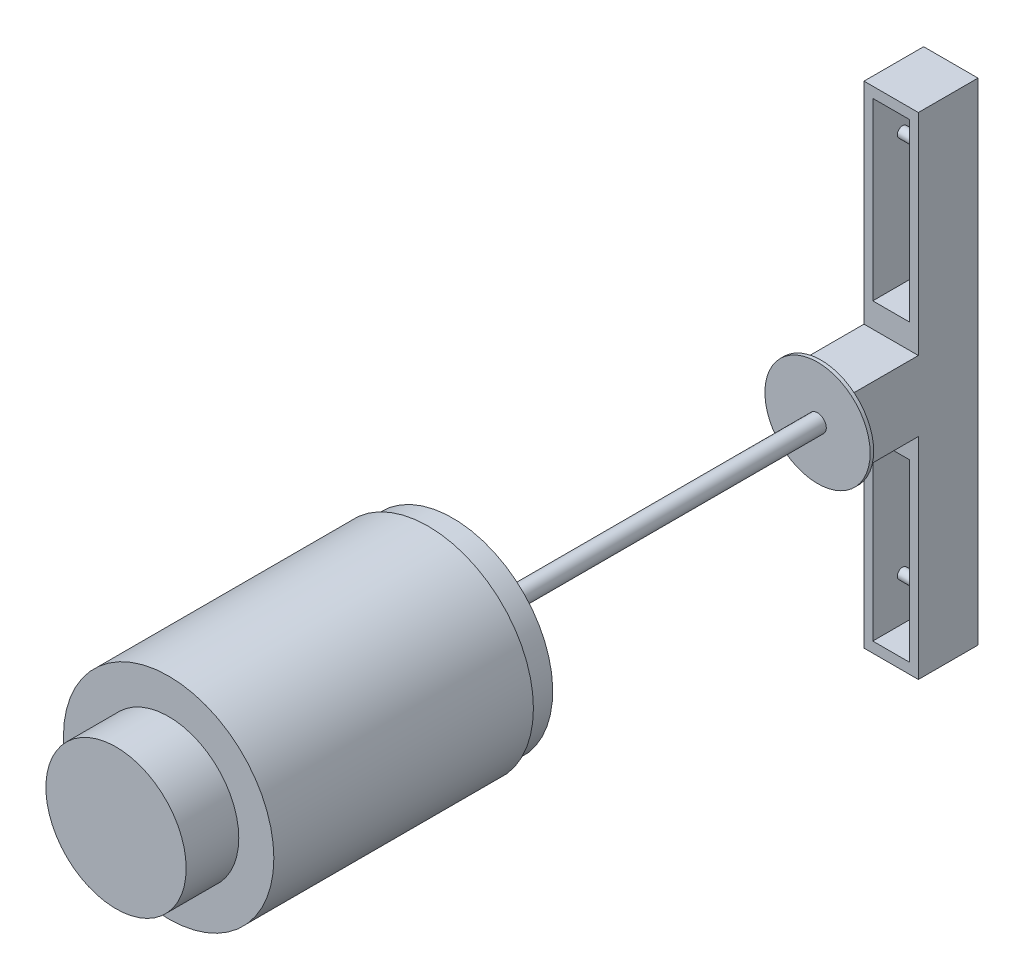
ISO-10303-21;
HEADER;
FILE_DESCRIPTION(('STEP AP214'),'2;1');
FILE_NAME('part.step','',(''),(''),'','','');
FILE_SCHEMA(('AUTOMOTIVE_DESIGN { 1 0 10303 214 1 1 1 1 }'));
ENDSEC;
DATA;
#1=APPLICATION_CONTEXT('core data for automotive mechanical design processes');
#2=APPLICATION_PROTOCOL_DEFINITION('international standard','automotive_design',2000,#1);
#3=PRODUCT_CONTEXT('',#1,'mechanical');
#4=PRODUCT('Part','Part','',(#3));
#5=PRODUCT_RELATED_PRODUCT_CATEGORY('part','',(#4));
#6=PRODUCT_DEFINITION_FORMATION('','',#4);
#7=PRODUCT_DEFINITION_CONTEXT('part definition',#1,'design');
#8=PRODUCT_DEFINITION('design','',#6,#7);
#9=PRODUCT_DEFINITION_SHAPE('','',#8);
#10=(LENGTH_UNIT() NAMED_UNIT(*) SI_UNIT(.MILLI.,.METRE.));
#11=(NAMED_UNIT(*) PLANE_ANGLE_UNIT() SI_UNIT($,.RADIAN.));
#12=(NAMED_UNIT(*) SI_UNIT($,.STERADIAN.) SOLID_ANGLE_UNIT());
#13=UNCERTAINTY_MEASURE_WITH_UNIT(LENGTH_MEASURE(1.E-05),#10,'distance_accuracy_value','');
#14=(GEOMETRIC_REPRESENTATION_CONTEXT(3) GLOBAL_UNCERTAINTY_ASSIGNED_CONTEXT((#13)) GLOBAL_UNIT_ASSIGNED_CONTEXT((#10,
#11,#12)) REPRESENTATION_CONTEXT('',''));
#15=CARTESIAN_POINT('',(0.,0.,0.));
#16=DIRECTION('',(0.,0.,1.));
#17=DIRECTION('',(1.,0.,0.));
#18=AXIS2_PLACEMENT_3D('',#15,#16,#17);
#19=CARTESIAN_POINT('',(-5.25,54.5,-28.5));
#20=DIRECTION('',(1.,0.,0.));
#21=DIRECTION('',(0.,0.,-1.));
#22=AXIS2_PLACEMENT_3D('',#19,#20,#21);
#23=CYLINDRICAL_SURFACE('',#22,1.5);
#24=CARTESIAN_POINT('',(5.25,54.5,-28.5));
#25=DIRECTION('',(1.,0.,0.));
#26=DIRECTION('',(0.,0.,-1.));
#27=AXIS2_PLACEMENT_3D('',#24,#25,#26);
#28=CIRCLE('',#27,1.5);
#29=CARTESIAN_POINT('',(5.25,54.5,-30.));
#30=VERTEX_POINT('',#29);
#31=EDGE_CURVE('E20',#30,#30,#28,.F.);
#32=ORIENTED_EDGE('',*,*,#31,.T.);
#33=EDGE_LOOP('',(#32));
#34=FACE_BOUND('',#33,.T.);
#35=CARTESIAN_POINT('',(-5.25,54.5,-28.5));
#36=DIRECTION('',(1.,0.,0.));
#37=DIRECTION('',(0.,0.,-1.));
#38=AXIS2_PLACEMENT_3D('',#35,#36,#37);
#39=CIRCLE('',#38,1.5);
#40=CARTESIAN_POINT('',(-5.25,54.5,-30.));
#41=VERTEX_POINT('',#40);
#42=EDGE_CURVE('E171',#41,#41,#39,.T.);
#43=ORIENTED_EDGE('',*,*,#42,.T.);
#44=EDGE_LOOP('',(#43));
#45=FACE_BOUND('',#44,.T.);
#46=ADVANCED_FACE('F17',(#34,#45),#23,.T.);
#47=CARTESIAN_POINT('',(-5.25,-54.5,-28.5));
#48=DIRECTION('',(1.,0.,0.));
#49=DIRECTION('',(0.,0.,-1.));
#50=AXIS2_PLACEMENT_3D('',#47,#48,#49);
#51=CYLINDRICAL_SURFACE('',#50,1.5);
#52=CARTESIAN_POINT('',(5.25,-54.5,-28.5));
#53=DIRECTION('',(1.,0.,0.));
#54=DIRECTION('',(0.,0.,-1.));
#55=AXIS2_PLACEMENT_3D('',#52,#53,#54);
#56=CIRCLE('',#55,1.5);
#57=CARTESIAN_POINT('',(5.25,-54.5,-30.));
#58=VERTEX_POINT('',#57);
#59=EDGE_CURVE('E163',#58,#58,#56,.F.);
#60=ORIENTED_EDGE('',*,*,#59,.T.);
#61=EDGE_LOOP('',(#60));
#62=FACE_BOUND('',#61,.T.);
#63=CARTESIAN_POINT('',(-5.25,-54.5,-28.5));
#64=DIRECTION('',(1.,0.,0.));
#65=DIRECTION('',(0.,0.,-1.));
#66=AXIS2_PLACEMENT_3D('',#63,#64,#65);
#67=CIRCLE('',#66,1.5);
#68=CARTESIAN_POINT('',(-5.25,-54.5,-30.));
#69=VERTEX_POINT('',#68);
#70=EDGE_CURVE('E141',#69,#69,#67,.T.);
#71=ORIENTED_EDGE('',*,*,#70,.T.);
#72=EDGE_LOOP('',(#71));
#73=FACE_BOUND('',#72,.T.);
#74=ADVANCED_FACE('F282',(#62,#73),#51,.T.);
#75=CARTESIAN_POINT('',(5.25,0.,0.));
#76=DIRECTION('',(1.,0.,0.));
#77=DIRECTION('',(0.,0.,-1.));
#78=AXIS2_PLACEMENT_3D('',#75,#76,#77);
#79=PLANE('',#78);
#80=ORIENTED_EDGE('',*,*,#31,.F.);
#81=EDGE_LOOP('',(#80));
#82=FACE_BOUND('',#81,.T.);
#83=DIRECTION('',(0.,0.,-1.));
#84=VECTOR('',#83,1.);
#85=CARTESIAN_POINT('',(5.25,17.,0.));
#86=LINE('',#85,#84);
#87=CARTESIAN_POINT('',(5.25,17.,-37.));
#88=VERTEX_POINT('',#87);
#89=CARTESIAN_POINT('',(5.25,17.,-20.));
#90=VERTEX_POINT('',#89);
#91=EDGE_CURVE('E168',#88,#90,#86,.F.);
#92=ORIENTED_EDGE('',*,*,#91,.T.);
#93=DIRECTION('',(0.,1.,0.));
#94=VECTOR('',#93,1.);
#95=CARTESIAN_POINT('',(5.25,0.,-20.));
#96=LINE('',#95,#94);
#97=CARTESIAN_POINT('',(5.25,67.,-20.));
#98=VERTEX_POINT('',#97);
#99=EDGE_CURVE('E236',#90,#98,#96,.T.);
#100=ORIENTED_EDGE('',*,*,#99,.T.);
#101=DIRECTION('',(0.,0.,1.));
#102=VECTOR('',#101,1.);
#103=CARTESIAN_POINT('',(5.25,67.,0.));
#104=LINE('',#103,#102);
#105=CARTESIAN_POINT('',(5.25,67.,-37.));
#106=VERTEX_POINT('',#105);
#107=EDGE_CURVE('E174',#98,#106,#104,.F.);
#108=ORIENTED_EDGE('',*,*,#107,.T.);
#109=DIRECTION('',(0.,1.,0.));
#110=VECTOR('',#109,1.);
#111=CARTESIAN_POINT('',(5.25,0.,-37.));
#112=LINE('',#111,#110);
#113=EDGE_CURVE('E246',#106,#88,#112,.F.);
#114=ORIENTED_EDGE('',*,*,#113,.T.);
#115=EDGE_LOOP('',(#92,#100,#108,#114));
#116=FACE_BOUND('',#115,.T.);
#117=ADVANCED_FACE('F280',(#82,#116),#79,.F.);
#118=CARTESIAN_POINT('',(0.,67.,0.));
#119=DIRECTION('',(0.,1.,0.));
#120=DIRECTION('',(0.,0.,1.));
#121=AXIS2_PLACEMENT_3D('',#118,#119,#120);
#122=PLANE('',#121);
#123=ORIENTED_EDGE('',*,*,#107,.F.);
#124=DIRECTION('',(-1.,0.,0.));
#125=VECTOR('',#124,1.);
#126=CARTESIAN_POINT('',(0.,67.,-20.));
#127=LINE('',#126,#125);
#128=CARTESIAN_POINT('',(-5.25,67.,-20.));
#129=VERTEX_POINT('',#128);
#130=EDGE_CURVE('E231',#98,#129,#127,.T.);
#131=ORIENTED_EDGE('',*,*,#130,.T.);
#132=DIRECTION('',(0.,0.,1.));
#133=VECTOR('',#132,1.);
#134=CARTESIAN_POINT('',(-5.25,67.,0.));
#135=LINE('',#134,#133);
#136=CARTESIAN_POINT('',(-5.25,67.,-37.));
#137=VERTEX_POINT('',#136);
#138=EDGE_CURVE('E172',#129,#137,#135,.F.);
#139=ORIENTED_EDGE('',*,*,#138,.T.);
#140=DIRECTION('',(1.,0.,0.));
#141=VECTOR('',#140,1.);
#142=CARTESIAN_POINT('',(0.,67.,-37.));
#143=LINE('',#142,#141);
#144=EDGE_CURVE('E249',#137,#106,#143,.T.);
#145=ORIENTED_EDGE('',*,*,#144,.T.);
#146=EDGE_LOOP('',(#123,#131,#139,#145));
#147=FACE_BOUND('',#146,.T.);
#148=ADVANCED_FACE('F214',(#147),#122,.F.);
#149=CARTESIAN_POINT('',(-5.25,0.,0.));
#150=DIRECTION('',(-1.,0.,0.));
#151=DIRECTION('',(0.,0.,1.));
#152=AXIS2_PLACEMENT_3D('',#149,#150,#151);
#153=PLANE('',#152);
#154=ORIENTED_EDGE('',*,*,#42,.F.);
#155=EDGE_LOOP('',(#154));
#156=FACE_BOUND('',#155,.T.);
#157=ORIENTED_EDGE('',*,*,#138,.F.);
#158=DIRECTION('',(0.,1.,0.));
#159=VECTOR('',#158,1.);
#160=CARTESIAN_POINT('',(-5.25,0.,-20.));
#161=LINE('',#160,#159);
#162=CARTESIAN_POINT('',(-5.25,17.,-20.));
#163=VERTEX_POINT('',#162);
#164=EDGE_CURVE('E219',#129,#163,#161,.F.);
#165=ORIENTED_EDGE('',*,*,#164,.T.);
#166=DIRECTION('',(0.,0.,-1.));
#167=VECTOR('',#166,1.);
#168=CARTESIAN_POINT('',(-5.25,17.,0.));
#169=LINE('',#168,#167);
#170=CARTESIAN_POINT('',(-5.25,17.,-37.));
#171=VERTEX_POINT('',#170);
#172=EDGE_CURVE('E166',#163,#171,#169,.T.);
#173=ORIENTED_EDGE('',*,*,#172,.T.);
#174=DIRECTION('',(0.,1.,0.));
#175=VECTOR('',#174,1.);
#176=CARTESIAN_POINT('',(-5.25,0.,-37.));
#177=LINE('',#176,#175);
#178=EDGE_CURVE('E221',#171,#137,#177,.T.);
#179=ORIENTED_EDGE('',*,*,#178,.T.);
#180=EDGE_LOOP('',(#157,#165,#173,#179));
#181=FACE_BOUND('',#180,.T.);
#182=ADVANCED_FACE('F210',(#156,#181),#153,.F.);
#183=CARTESIAN_POINT('',(0.,17.,0.));
#184=DIRECTION('',(0.,-1.,0.));
#185=DIRECTION('',(0.,0.,-1.));
#186=AXIS2_PLACEMENT_3D('',#183,#184,#185);
#187=PLANE('',#186);
#188=ORIENTED_EDGE('',*,*,#172,.F.);
#189=DIRECTION('',(-1.,0.,0.));
#190=VECTOR('',#189,1.);
#191=CARTESIAN_POINT('',(0.,17.,-20.));
#192=LINE('',#191,#190);
#193=EDGE_CURVE('E234',#163,#90,#192,.F.);
#194=ORIENTED_EDGE('',*,*,#193,.T.);
#195=ORIENTED_EDGE('',*,*,#91,.F.);
#196=DIRECTION('',(1.,0.,0.));
#197=VECTOR('',#196,1.);
#198=CARTESIAN_POINT('',(0.,17.,-37.));
#199=LINE('',#198,#197);
#200=EDGE_CURVE('E252',#88,#171,#199,.F.);
#201=ORIENTED_EDGE('',*,*,#200,.T.);
#202=EDGE_LOOP('',(#188,#194,#195,#201));
#203=FACE_BOUND('',#202,.T.);
#204=ADVANCED_FACE('F213',(#203),#187,.F.);
#205=CARTESIAN_POINT('',(0.,-67.,0.));
#206=DIRECTION('',(0.,1.,0.));
#207=DIRECTION('',(0.,0.,1.));
#208=AXIS2_PLACEMENT_3D('',#205,#206,#207);
#209=PLANE('',#208);
#210=DIRECTION('',(-1.,0.,0.));
#211=VECTOR('',#210,1.);
#212=CARTESIAN_POINT('',(0.,-67.,-20.));
#213=LINE('',#212,#211);
#214=CARTESIAN_POINT('',(-5.25,-67.,-20.));
#215=VERTEX_POINT('',#214);
#216=CARTESIAN_POINT('',(5.25,-67.,-20.));
#217=VERTEX_POINT('',#216);
#218=EDGE_CURVE('E269',#215,#217,#213,.F.);
#219=ORIENTED_EDGE('',*,*,#218,.T.);
#220=DIRECTION('',(0.,0.,-1.));
#221=VECTOR('',#220,1.);
#222=CARTESIAN_POINT('',(5.25,-67.,0.));
#223=LINE('',#222,#221);
#224=CARTESIAN_POINT('',(5.25,-67.,-37.));
#225=VERTEX_POINT('',#224);
#226=EDGE_CURVE('E164',#217,#225,#223,.T.);
#227=ORIENTED_EDGE('',*,*,#226,.T.);
#228=DIRECTION('',(1.,0.,0.));
#229=VECTOR('',#228,1.);
#230=CARTESIAN_POINT('',(0.,-67.,-37.));
#231=LINE('',#230,#229);
#232=CARTESIAN_POINT('',(-5.25,-67.,-37.));
#233=VERTEX_POINT('',#232);
#234=EDGE_CURVE('E255',#225,#233,#231,.F.);
#235=ORIENTED_EDGE('',*,*,#234,.T.);
#236=DIRECTION('',(0.,0.,1.));
#237=VECTOR('',#236,1.);
#238=CARTESIAN_POINT('',(-5.25,-67.,0.));
#239=LINE('',#238,#237);
#240=EDGE_CURVE('E128',#233,#215,#239,.T.);
#241=ORIENTED_EDGE('',*,*,#240,.T.);
#242=EDGE_LOOP('',(#219,#227,#235,#241));
#243=FACE_BOUND('',#242,.T.);
#244=ADVANCED_FACE('F378',(#243),#209,.T.);
#245=CARTESIAN_POINT('',(5.25,0.,0.));
#246=DIRECTION('',(1.,0.,0.));
#247=DIRECTION('',(0.,0.,-1.));
#248=AXIS2_PLACEMENT_3D('',#245,#246,#247);
#249=PLANE('',#248);
#250=ORIENTED_EDGE('',*,*,#59,.F.);
#251=EDGE_LOOP('',(#250));
#252=FACE_BOUND('',#251,.T.);
#253=ORIENTED_EDGE('',*,*,#226,.F.);
#254=DIRECTION('',(0.,1.,0.));
#255=VECTOR('',#254,1.);
#256=CARTESIAN_POINT('',(5.25,0.,-20.));
#257=LINE('',#256,#255);
#258=CARTESIAN_POINT('',(5.25,-17.,-20.));
#259=VERTEX_POINT('',#258);
#260=EDGE_CURVE('E260',#217,#259,#257,.T.);
#261=ORIENTED_EDGE('',*,*,#260,.T.);
#262=DIRECTION('',(0.,0.,-1.));
#263=VECTOR('',#262,1.);
#264=CARTESIAN_POINT('',(5.25,-17.,0.));
#265=LINE('',#264,#263);
#266=CARTESIAN_POINT('',(5.25,-17.,-37.));
#267=VERTEX_POINT('',#266);
#268=EDGE_CURVE('E161',#259,#267,#265,.T.);
#269=ORIENTED_EDGE('',*,*,#268,.T.);
#270=DIRECTION('',(0.,1.,0.));
#271=VECTOR('',#270,1.);
#272=CARTESIAN_POINT('',(5.25,0.,-37.));
#273=LINE('',#272,#271);
#274=EDGE_CURVE('E151',#267,#225,#273,.F.);
#275=ORIENTED_EDGE('',*,*,#274,.T.);
#276=EDGE_LOOP('',(#253,#261,#269,#275));
#277=FACE_BOUND('',#276,.T.);
#278=ADVANCED_FACE('F257',(#252,#277),#249,.F.);
#279=CARTESIAN_POINT('',(0.,-17.,0.));
#280=DIRECTION('',(0.,-1.,0.));
#281=DIRECTION('',(0.,0.,-1.));
#282=AXIS2_PLACEMENT_3D('',#279,#280,#281);
#283=PLANE('',#282);
#284=DIRECTION('',(-1.,0.,0.));
#285=VECTOR('',#284,1.);
#286=CARTESIAN_POINT('',(0.,-17.,-20.));
#287=LINE('',#286,#285);
#288=CARTESIAN_POINT('',(-5.25,-17.,-20.));
#289=VERTEX_POINT('',#288);
#290=EDGE_CURVE('E139',#259,#289,#287,.T.);
#291=ORIENTED_EDGE('',*,*,#290,.T.);
#292=DIRECTION('',(0.,0.,1.));
#293=VECTOR('',#292,1.);
#294=CARTESIAN_POINT('',(-5.25,-17.,0.));
#295=LINE('',#294,#293);
#296=CARTESIAN_POINT('',(-5.25,-17.,-37.));
#297=VERTEX_POINT('',#296);
#298=EDGE_CURVE('E134',#289,#297,#295,.F.);
#299=ORIENTED_EDGE('',*,*,#298,.T.);
#300=DIRECTION('',(1.,0.,0.));
#301=VECTOR('',#300,1.);
#302=CARTESIAN_POINT('',(0.,-17.,-37.));
#303=LINE('',#302,#301);
#304=EDGE_CURVE('E137',#297,#267,#303,.T.);
#305=ORIENTED_EDGE('',*,*,#304,.T.);
#306=ORIENTED_EDGE('',*,*,#268,.F.);
#307=EDGE_LOOP('',(#291,#299,#305,#306));
#308=FACE_BOUND('',#307,.T.);
#309=ADVANCED_FACE('F136',(#308),#283,.T.);
#310=CARTESIAN_POINT('',(-5.25,0.,0.));
#311=DIRECTION('',(-1.,0.,0.));
#312=DIRECTION('',(0.,0.,1.));
#313=AXIS2_PLACEMENT_3D('',#310,#311,#312);
#314=PLANE('',#313);
#315=ORIENTED_EDGE('',*,*,#70,.F.);
#316=EDGE_LOOP('',(#315));
#317=FACE_BOUND('',#316,.T.);
#318=ORIENTED_EDGE('',*,*,#298,.F.);
#319=DIRECTION('',(0.,1.,0.));
#320=VECTOR('',#319,1.);
#321=CARTESIAN_POINT('',(-5.25,0.,-20.));
#322=LINE('',#321,#320);
#323=EDGE_CURVE('E265',#289,#215,#322,.F.);
#324=ORIENTED_EDGE('',*,*,#323,.T.);
#325=ORIENTED_EDGE('',*,*,#240,.F.);
#326=DIRECTION('',(0.,1.,0.));
#327=VECTOR('',#326,1.);
#328=CARTESIAN_POINT('',(-5.25,0.,-37.));
#329=LINE('',#328,#327);
#330=EDGE_CURVE('E148',#233,#297,#329,.T.);
#331=ORIENTED_EDGE('',*,*,#330,.T.);
#332=EDGE_LOOP('',(#318,#324,#325,#331));
#333=FACE_BOUND('',#332,.T.);
#334=ADVANCED_FACE('F153',(#317,#333),#314,.F.);
#335=CARTESIAN_POINT('',(0.,70.,0.));
#336=DIRECTION('',(0.,1.,0.));
#337=DIRECTION('',(0.,0.,1.));
#338=AXIS2_PLACEMENT_3D('',#335,#336,#337);
#339=PLANE('',#338);
#340=DIRECTION('',(1.,0.,0.));
#341=VECTOR('',#340,1.);
#342=CARTESIAN_POINT('',(0.,70.,-37.));
#343=LINE('',#342,#341);
#344=CARTESIAN_POINT('',(7.75,70.,-37.));
#345=VERTEX_POINT('',#344);
#346=CARTESIAN_POINT('',(-7.75,70.,-37.));
#347=VERTEX_POINT('',#346);
#348=EDGE_CURVE('E154',#345,#347,#343,.F.);
#349=ORIENTED_EDGE('',*,*,#348,.T.);
#350=DIRECTION('',(0.,0.,1.));
#351=VECTOR('',#350,1.);
#352=CARTESIAN_POINT('',(-7.75,70.,0.));
#353=LINE('',#352,#351);
#354=CARTESIAN_POINT('',(-7.75,70.,-20.));
#355=VERTEX_POINT('',#354);
#356=EDGE_CURVE('E267',#347,#355,#353,.T.);
#357=ORIENTED_EDGE('',*,*,#356,.T.);
#358=DIRECTION('',(-1.,0.,0.));
#359=VECTOR('',#358,1.);
#360=CARTESIAN_POINT('',(0.,70.,-20.));
#361=LINE('',#360,#359);
#362=CARTESIAN_POINT('',(7.75,70.,-20.));
#363=VERTEX_POINT('',#362);
#364=EDGE_CURVE('E238',#355,#363,#361,.F.);
#365=ORIENTED_EDGE('',*,*,#364,.T.);
#366=DIRECTION('',(0.,0.,-1.));
#367=VECTOR('',#366,1.);
#368=CARTESIAN_POINT('',(7.75,70.,0.));
#369=LINE('',#368,#367);
#370=EDGE_CURVE('E576',#363,#345,#369,.T.);
#371=ORIENTED_EDGE('',*,*,#370,.T.);
#372=EDGE_LOOP('',(#349,#357,#365,#371));
#373=FACE_BOUND('',#372,.T.);
#374=ADVANCED_FACE('F367',(#373),#339,.T.);
#375=CARTESIAN_POINT('',(0.,0.,-37.));
#376=DIRECTION('',(0.,0.,1.));
#377=DIRECTION('',(1.,0.,0.));
#378=AXIS2_PLACEMENT_3D('',#375,#376,#377);
#379=PLANE('',#378);
#380=ORIENTED_EDGE('',*,*,#144,.F.);
#381=ORIENTED_EDGE('',*,*,#178,.F.);
#382=ORIENTED_EDGE('',*,*,#200,.F.);
#383=ORIENTED_EDGE('',*,*,#113,.F.);
#384=EDGE_LOOP('',(#380,#381,#382,#383));
#385=FACE_BOUND('',#384,.T.);
#386=ORIENTED_EDGE('',*,*,#274,.F.);
#387=ORIENTED_EDGE('',*,*,#304,.F.);
#388=ORIENTED_EDGE('',*,*,#330,.F.);
#389=ORIENTED_EDGE('',*,*,#234,.F.);
#390=EDGE_LOOP('',(#386,#387,#388,#389));
#391=FACE_BOUND('',#390,.T.);
#392=DIRECTION('',(1.,0.,0.));
#393=VECTOR('',#392,1.);
#394=CARTESIAN_POINT('',(0.,-70.,-37.));
#395=LINE('',#394,#393);
#396=CARTESIAN_POINT('',(7.75,-70.,-37.));
#397=VERTEX_POINT('',#396);
#398=CARTESIAN_POINT('',(-7.75,-70.,-37.));
#399=VERTEX_POINT('',#398);
#400=EDGE_CURVE('E244',#397,#399,#395,.F.);
#401=ORIENTED_EDGE('',*,*,#400,.T.);
#402=DIRECTION('',(0.,1.,0.));
#403=VECTOR('',#402,1.);
#404=CARTESIAN_POINT('',(-7.75,0.,-37.));
#405=LINE('',#404,#403);
#406=EDGE_CURVE('E580',#399,#347,#405,.T.);
#407=ORIENTED_EDGE('',*,*,#406,.T.);
#408=ORIENTED_EDGE('',*,*,#348,.F.);
#409=DIRECTION('',(0.,1.,0.));
#410=VECTOR('',#409,1.);
#411=CARTESIAN_POINT('',(7.75,0.,-37.));
#412=LINE('',#411,#410);
#413=EDGE_CURVE('E605',#345,#397,#412,.F.);
#414=ORIENTED_EDGE('',*,*,#413,.T.);
#415=EDGE_LOOP('',(#401,#407,#408,#414));
#416=FACE_BOUND('',#415,.T.);
#417=ADVANCED_FACE('F145',(#385,#391,#416),#379,.F.);
#418=CARTESIAN_POINT('',(0.,-70.,0.));
#419=DIRECTION('',(0.,1.,0.));
#420=DIRECTION('',(0.,0.,1.));
#421=AXIS2_PLACEMENT_3D('',#418,#419,#420);
#422=PLANE('',#421);
#423=DIRECTION('',(0.,0.,1.));
#424=VECTOR('',#423,1.);
#425=CARTESIAN_POINT('',(-7.75,-70.,0.));
#426=LINE('',#425,#424);
#427=CARTESIAN_POINT('',(-7.75,-70.,-20.));
#428=VERTEX_POINT('',#427);
#429=EDGE_CURVE('E584',#428,#399,#426,.F.);
#430=ORIENTED_EDGE('',*,*,#429,.T.);
#431=ORIENTED_EDGE('',*,*,#400,.F.);
#432=DIRECTION('',(0.,0.,-1.));
#433=VECTOR('',#432,1.);
#434=CARTESIAN_POINT('',(7.75,-70.,0.));
#435=LINE('',#434,#433);
#436=CARTESIAN_POINT('',(7.75,-70.,-20.));
#437=VERTEX_POINT('',#436);
#438=EDGE_CURVE('E609',#397,#437,#435,.F.);
#439=ORIENTED_EDGE('',*,*,#438,.T.);
#440=DIRECTION('',(-1.,0.,0.));
#441=VECTOR('',#440,1.);
#442=CARTESIAN_POINT('',(0.,-70.,-20.));
#443=LINE('',#442,#441);
#444=EDGE_CURVE('E274',#437,#428,#443,.T.);
#445=ORIENTED_EDGE('',*,*,#444,.T.);
#446=EDGE_LOOP('',(#430,#431,#439,#445));
#447=FACE_BOUND('',#446,.T.);
#448=ADVANCED_FACE('F361',(#447),#422,.F.);
#449=CARTESIAN_POINT('',(0.,0.,-20.));
#450=DIRECTION('',(0.,0.,-1.));
#451=DIRECTION('',(-1.,0.,0.));
#452=AXIS2_PLACEMENT_3D('',#449,#450,#451);
#453=PLANE('',#452);
#454=ORIENTED_EDGE('',*,*,#164,.F.);
#455=ORIENTED_EDGE('',*,*,#130,.F.);
#456=ORIENTED_EDGE('',*,*,#99,.F.);
#457=ORIENTED_EDGE('',*,*,#193,.F.);
#458=EDGE_LOOP('',(#454,#455,#456,#457));
#459=FACE_BOUND('',#458,.T.);
#460=DIRECTION('',(0.,1.,0.));
#461=VECTOR('',#460,1.);
#462=CARTESIAN_POINT('',(7.75,0.,-20.));
#463=LINE('',#462,#461);
#464=CARTESIAN_POINT('',(7.75,10.,-20.));
#465=VERTEX_POINT('',#464);
#466=EDGE_CURVE('E618',#465,#363,#463,.T.);
#467=ORIENTED_EDGE('',*,*,#466,.T.);
#468=ORIENTED_EDGE('',*,*,#364,.F.);
#469=DIRECTION('',(0.,1.,0.));
#470=VECTOR('',#469,1.);
#471=CARTESIAN_POINT('',(-7.75,0.,-20.));
#472=LINE('',#471,#470);
#473=CARTESIAN_POINT('',(-7.75,10.,-20.));
#474=VERTEX_POINT('',#473);
#475=EDGE_CURVE('E594',#355,#474,#472,.F.);
#476=ORIENTED_EDGE('',*,*,#475,.T.);
#477=DIRECTION('',(1.,0.,0.));
#478=VECTOR('',#477,1.);
#479=CARTESIAN_POINT('',(0.,10.,-20.));
#480=LINE('',#479,#478);
#481=EDGE_CURVE('E583',#474,#465,#480,.T.);
#482=ORIENTED_EDGE('',*,*,#481,.T.);
#483=EDGE_LOOP('',(#467,#468,#476,#482));
#484=FACE_BOUND('',#483,.T.);
#485=ADVANCED_FACE('F229',(#459,#484),#453,.F.);
#486=CARTESIAN_POINT('',(0.,0.,-20.));
#487=DIRECTION('',(0.,0.,-1.));
#488=DIRECTION('',(-1.,0.,0.));
#489=AXIS2_PLACEMENT_3D('',#486,#487,#488);
#490=PLANE('',#489);
#491=ORIENTED_EDGE('',*,*,#290,.F.);
#492=ORIENTED_EDGE('',*,*,#260,.F.);
#493=ORIENTED_EDGE('',*,*,#218,.F.);
#494=ORIENTED_EDGE('',*,*,#323,.F.);
#495=EDGE_LOOP('',(#491,#492,#493,#494));
#496=FACE_BOUND('',#495,.T.);
#497=DIRECTION('',(0.,1.,0.));
#498=VECTOR('',#497,1.);
#499=CARTESIAN_POINT('',(-7.75,0.,-20.));
#500=LINE('',#499,#498);
#501=CARTESIAN_POINT('',(-7.75,-10.,-20.));
#502=VERTEX_POINT('',#501);
#503=EDGE_CURVE('E588',#502,#428,#500,.F.);
#504=ORIENTED_EDGE('',*,*,#503,.T.);
#505=ORIENTED_EDGE('',*,*,#444,.F.);
#506=DIRECTION('',(0.,1.,0.));
#507=VECTOR('',#506,1.);
#508=CARTESIAN_POINT('',(7.75,0.,-20.));
#509=LINE('',#508,#507);
#510=CARTESIAN_POINT('',(7.75,-10.,-20.));
#511=VERTEX_POINT('',#510);
#512=EDGE_CURVE('E612',#437,#511,#509,.T.);
#513=ORIENTED_EDGE('',*,*,#512,.T.);
#514=DIRECTION('',(1.,0.,0.));
#515=VECTOR('',#514,1.);
#516=CARTESIAN_POINT('',(0.,-10.,-20.));
#517=LINE('',#516,#515);
#518=EDGE_CURVE('E620',#511,#502,#517,.F.);
#519=ORIENTED_EDGE('',*,*,#518,.T.);
#520=EDGE_LOOP('',(#504,#505,#513,#519));
#521=FACE_BOUND('',#520,.T.);
#522=ADVANCED_FACE('F262',(#496,#521),#490,.F.);
#523=CARTESIAN_POINT('',(-7.75,0.,0.));
#524=DIRECTION('',(-1.,0.,0.));
#525=DIRECTION('',(0.,0.,1.));
#526=AXIS2_PLACEMENT_3D('',#523,#524,#525);
#527=PLANE('',#526);
#528=ORIENTED_EDGE('',*,*,#429,.F.);
#529=ORIENTED_EDGE('',*,*,#503,.F.);
#530=DIRECTION('',(0.,0.,-1.));
#531=VECTOR('',#530,1.);
#532=CARTESIAN_POINT('',(-7.75,-10.,0.));
#533=LINE('',#532,#531);
#534=CARTESIAN_POINT('',(-7.75,-10.,0.));
#535=VERTEX_POINT('',#534);
#536=EDGE_CURVE('E623',#502,#535,#533,.F.);
#537=ORIENTED_EDGE('',*,*,#536,.T.);
#538=DIRECTION('',(0.,1.,0.));
#539=VECTOR('',#538,1.);
#540=CARTESIAN_POINT('',(-7.75,0.,0.));
#541=LINE('',#540,#539);
#542=CARTESIAN_POINT('',(-7.75,10.,0.));
#543=VERTEX_POINT('',#542);
#544=EDGE_CURVE('E602',#535,#543,#541,.T.);
#545=ORIENTED_EDGE('',*,*,#544,.T.);
#546=DIRECTION('',(0.,0.,1.));
#547=VECTOR('',#546,1.);
#548=CARTESIAN_POINT('',(-7.75,10.,0.));
#549=LINE('',#548,#547);
#550=EDGE_CURVE('E586',#543,#474,#549,.F.);
#551=ORIENTED_EDGE('',*,*,#550,.T.);
#552=ORIENTED_EDGE('',*,*,#475,.F.);
#553=ORIENTED_EDGE('',*,*,#356,.F.);
#554=ORIENTED_EDGE('',*,*,#406,.F.);
#555=EDGE_LOOP('',(#528,#529,#537,#545,#551,#552,#553,#554));
#556=FACE_BOUND('',#555,.T.);
#557=ADVANCED_FACE('F352',(#556),#527,.T.);
#558=CARTESIAN_POINT('',(0.,10.,0.));
#559=DIRECTION('',(0.,1.,0.));
#560=DIRECTION('',(0.,0.,1.));
#561=AXIS2_PLACEMENT_3D('',#558,#559,#560);
#562=PLANE('',#561);
#563=DIRECTION('',(1.,0.,0.));
#564=VECTOR('',#563,1.);
#565=CARTESIAN_POINT('',(0.,10.,0.));
#566=LINE('',#565,#564);
#567=CARTESIAN_POINT('',(7.75,10.,0.));
#568=VERTEX_POINT('',#567);
#569=EDGE_CURVE('E627',#543,#568,#566,.T.);
#570=ORIENTED_EDGE('',*,*,#569,.T.);
#571=DIRECTION('',(0.,0.,-1.));
#572=VECTOR('',#571,1.);
#573=CARTESIAN_POINT('',(7.75,10.,0.));
#574=LINE('',#573,#572);
#575=EDGE_CURVE('E615',#568,#465,#574,.T.);
#576=ORIENTED_EDGE('',*,*,#575,.T.);
#577=ORIENTED_EDGE('',*,*,#481,.F.);
#578=ORIENTED_EDGE('',*,*,#550,.F.);
#579=EDGE_LOOP('',(#570,#576,#577,#578));
#580=FACE_BOUND('',#579,.T.);
#581=ADVANCED_FACE('F348',(#580),#562,.T.);
#582=CARTESIAN_POINT('',(7.75,0.,0.));
#583=DIRECTION('',(1.,0.,0.));
#584=DIRECTION('',(0.,0.,-1.));
#585=AXIS2_PLACEMENT_3D('',#582,#583,#584);
#586=PLANE('',#585);
#587=ORIENTED_EDGE('',*,*,#575,.F.);
#588=DIRECTION('',(0.,1.,0.));
#589=VECTOR('',#588,1.);
#590=CARTESIAN_POINT('',(7.75,0.,0.));
#591=LINE('',#590,#589);
#592=CARTESIAN_POINT('',(7.75,-10.,0.));
#593=VERTEX_POINT('',#592);
#594=EDGE_CURVE('E629',#568,#593,#591,.F.);
#595=ORIENTED_EDGE('',*,*,#594,.T.);
#596=DIRECTION('',(0.,0.,-1.));
#597=VECTOR('',#596,1.);
#598=CARTESIAN_POINT('',(7.75,-10.,0.));
#599=LINE('',#598,#597);
#600=EDGE_CURVE('E35',#593,#511,#599,.T.);
#601=ORIENTED_EDGE('',*,*,#600,.T.);
#602=ORIENTED_EDGE('',*,*,#512,.F.);
#603=ORIENTED_EDGE('',*,*,#438,.F.);
#604=ORIENTED_EDGE('',*,*,#413,.F.);
#605=ORIENTED_EDGE('',*,*,#370,.F.);
#606=ORIENTED_EDGE('',*,*,#466,.F.);
#607=EDGE_LOOP('',(#587,#595,#601,#602,#603,#604,#605,#606));
#608=FACE_BOUND('',#607,.T.);
#609=ADVANCED_FACE('F345',(#608),#586,.T.);
#610=CARTESIAN_POINT('',(0.,-10.,0.));
#611=DIRECTION('',(0.,-1.,0.));
#612=DIRECTION('',(0.,0.,-1.));
#613=AXIS2_PLACEMENT_3D('',#610,#611,#612);
#614=PLANE('',#613);
#615=DIRECTION('',(1.,0.,0.));
#616=VECTOR('',#615,1.);
#617=CARTESIAN_POINT('',(0.,-10.,0.));
#618=LINE('',#617,#616);
#619=EDGE_CURVE('E202',#593,#535,#618,.F.);
#620=ORIENTED_EDGE('',*,*,#619,.T.);
#621=ORIENTED_EDGE('',*,*,#536,.F.);
#622=ORIENTED_EDGE('',*,*,#518,.F.);
#623=ORIENTED_EDGE('',*,*,#600,.F.);
#624=EDGE_LOOP('',(#620,#621,#622,#623));
#625=FACE_BOUND('',#624,.T.);
#626=ADVANCED_FACE('F341',(#625),#614,.T.);
#627=CARTESIAN_POINT('',(0.,0.,0.));
#628=DIRECTION('',(0.,0.,1.));
#629=DIRECTION('',(1.,0.,0.));
#630=AXIS2_PLACEMENT_3D('',#627,#628,#629);
#631=PLANE('',#630);
#632=ORIENTED_EDGE('',*,*,#594,.F.);
#633=ORIENTED_EDGE('',*,*,#569,.F.);
#634=ORIENTED_EDGE('',*,*,#544,.F.);
#635=ORIENTED_EDGE('',*,*,#619,.F.);
#636=EDGE_LOOP('',(#632,#633,#634,#635));
#637=FACE_BOUND('',#636,.T.);
#638=CARTESIAN_POINT('',(0.,0.,0.));
#639=DIRECTION('',(0.,0.,1.));
#640=DIRECTION('',(1.,0.,0.));
#641=AXIS2_PLACEMENT_3D('',#638,#639,#640);
#642=CIRCLE('',#641,15.);
#643=CARTESIAN_POINT('',(15.,0.,0.));
#644=VERTEX_POINT('',#643);
#645=EDGE_CURVE('E199',#644,#644,#642,.F.);
#646=ORIENTED_EDGE('',*,*,#645,.T.);
#647=EDGE_LOOP('',(#646));
#648=FACE_BOUND('',#647,.T.);
#649=ADVANCED_FACE('F337',(#637,#648),#631,.F.);
#650=CARTESIAN_POINT('',(0.,0.,0.));
#651=DIRECTION('',(0.,0.,1.));
#652=DIRECTION('',(1.,0.,0.));
#653=AXIS2_PLACEMENT_3D('',#650,#651,#652);
#654=CYLINDRICAL_SURFACE('',#653,15.);
#655=ORIENTED_EDGE('',*,*,#645,.F.);
#656=EDGE_LOOP('',(#655));
#657=FACE_BOUND('',#656,.T.);
#658=CARTESIAN_POINT('',(0.,0.,1.));
#659=DIRECTION('',(0.,0.,1.));
#660=DIRECTION('',(1.,0.,0.));
#661=AXIS2_PLACEMENT_3D('',#658,#659,#660);
#662=CIRCLE('',#661,15.);
#663=CARTESIAN_POINT('',(15.,0.,1.));
#664=VERTEX_POINT('',#663);
#665=EDGE_CURVE('E196',#664,#664,#662,.F.);
#666=ORIENTED_EDGE('',*,*,#665,.T.);
#667=EDGE_LOOP('',(#666));
#668=FACE_BOUND('',#667,.T.);
#669=ADVANCED_FACE('F333',(#657,#668),#654,.T.);
#670=CARTESIAN_POINT('',(0.,0.,1.));
#671=DIRECTION('',(0.,0.,1.));
#672=DIRECTION('',(1.,0.,0.));
#673=AXIS2_PLACEMENT_3D('',#670,#671,#672);
#674=PLANE('',#673);
#675=CARTESIAN_POINT('',(0.,0.,1.));
#676=DIRECTION('',(0.,0.,1.));
#677=DIRECTION('',(1.,0.,0.));
#678=AXIS2_PLACEMENT_3D('',#675,#676,#677);
#679=CIRCLE('',#678,2.5);
#680=CARTESIAN_POINT('',(2.5,0.,1.));
#681=VERTEX_POINT('',#680);
#682=EDGE_CURVE('E193',#681,#681,#679,.F.);
#683=ORIENTED_EDGE('',*,*,#682,.T.);
#684=EDGE_LOOP('',(#683));
#685=FACE_BOUND('',#684,.T.);
#686=ORIENTED_EDGE('',*,*,#665,.F.);
#687=EDGE_LOOP('',(#686));
#688=FACE_BOUND('',#687,.T.);
#689=ADVANCED_FACE('F329',(#685,#688),#674,.T.);
#690=CARTESIAN_POINT('',(0.,0.,1.));
#691=DIRECTION('',(0.,0.,1.));
#692=DIRECTION('',(1.,0.,0.));
#693=AXIS2_PLACEMENT_3D('',#690,#691,#692);
#694=CYLINDRICAL_SURFACE('',#693,2.5);
#695=ORIENTED_EDGE('',*,*,#682,.F.);
#696=EDGE_LOOP('',(#695));
#697=FACE_BOUND('',#696,.T.);
#698=CARTESIAN_POINT('',(0.,0.,105.));
#699=DIRECTION('',(0.,0.,1.));
#700=DIRECTION('',(1.,0.,0.));
#701=AXIS2_PLACEMENT_3D('',#698,#699,#700);
#702=CIRCLE('',#701,2.5);
#703=CARTESIAN_POINT('',(2.5,0.,105.));
#704=VERTEX_POINT('',#703);
#705=EDGE_CURVE('E190',#704,#704,#702,.F.);
#706=ORIENTED_EDGE('',*,*,#705,.T.);
#707=EDGE_LOOP('',(#706));
#708=FACE_BOUND('',#707,.T.);
#709=ADVANCED_FACE('F325',(#697,#708),#694,.T.);
#710=CARTESIAN_POINT('',(0.,0.,105.));
#711=DIRECTION('',(0.,0.,1.));
#712=DIRECTION('',(1.,0.,0.));
#713=AXIS2_PLACEMENT_3D('',#710,#711,#712);
#714=PLANE('',#713);
#715=ORIENTED_EDGE('',*,*,#705,.F.);
#716=EDGE_LOOP('',(#715));
#717=FACE_BOUND('',#716,.T.);
#718=CARTESIAN_POINT('',(0.,0.,105.));
#719=DIRECTION('',(0.,0.,1.));
#720=DIRECTION('',(0.,-1.,0.));
#721=AXIS2_PLACEMENT_3D('',#718,#719,#720);
#722=CIRCLE('',#721,28.5);
#723=CARTESIAN_POINT('',(0.,-28.5,105.));
#724=VERTEX_POINT('',#723);
#725=EDGE_CURVE('E187',#724,#724,#722,.F.);
#726=ORIENTED_EDGE('',*,*,#725,.T.);
#727=EDGE_LOOP('',(#726));
#728=FACE_BOUND('',#727,.T.);
#729=ADVANCED_FACE('F321',(#717,#728),#714,.F.);
#730=CARTESIAN_POINT('',(0.,0.,105.));
#731=DIRECTION('',(0.,0.,1.));
#732=DIRECTION('',(0.,-1.,0.));
#733=AXIS2_PLACEMENT_3D('',#730,#731,#732);
#734=CYLINDRICAL_SURFACE('',#733,28.5);
#735=ORIENTED_EDGE('',*,*,#725,.F.);
#736=EDGE_LOOP('',(#735));
#737=FACE_BOUND('',#736,.T.);
#738=CARTESIAN_POINT('',(0.,0.,112.));
#739=DIRECTION('',(0.,0.,1.));
#740=DIRECTION('',(0.,-1.,0.));
#741=AXIS2_PLACEMENT_3D('',#738,#739,#740);
#742=CIRCLE('',#741,28.5);
#743=CARTESIAN_POINT('',(0.,-28.5,112.));
#744=VERTEX_POINT('',#743);
#745=EDGE_CURVE('E184',#744,#744,#742,.F.);
#746=ORIENTED_EDGE('',*,*,#745,.T.);
#747=EDGE_LOOP('',(#746));
#748=FACE_BOUND('',#747,.T.);
#749=ADVANCED_FACE('F317',(#737,#748),#734,.T.);
#750=CARTESIAN_POINT('',(0.,0.,112.));
#751=DIRECTION('',(0.,0.,1.));
#752=DIRECTION('',(1.,0.,0.));
#753=AXIS2_PLACEMENT_3D('',#750,#751,#752);
#754=PLANE('',#753);
#755=ORIENTED_EDGE('',*,*,#745,.F.);
#756=EDGE_LOOP('',(#755));
#757=FACE_BOUND('',#756,.T.);
#758=CARTESIAN_POINT('',(0.,0.,112.));
#759=DIRECTION('',(0.,0.,1.));
#760=DIRECTION('',(0.,-1.,0.));
#761=AXIS2_PLACEMENT_3D('',#758,#759,#760);
#762=CIRCLE('',#761,30.);
#763=CARTESIAN_POINT('',(0.,-30.,112.));
#764=VERTEX_POINT('',#763);
#765=EDGE_CURVE('E181',#764,#764,#762,.F.);
#766=ORIENTED_EDGE('',*,*,#765,.T.);
#767=EDGE_LOOP('',(#766));
#768=FACE_BOUND('',#767,.T.);
#769=ADVANCED_FACE('F313',(#757,#768),#754,.F.);
#770=CARTESIAN_POINT('',(0.,0.,112.));
#771=DIRECTION('',(0.,0.,1.));
#772=DIRECTION('',(0.,-1.,0.));
#773=AXIS2_PLACEMENT_3D('',#770,#771,#772);
#774=CYLINDRICAL_SURFACE('',#773,30.);
#775=ORIENTED_EDGE('',*,*,#765,.F.);
#776=EDGE_LOOP('',(#775));
#777=FACE_BOUND('',#776,.T.);
#778=CARTESIAN_POINT('',(0.,0.,186.));
#779=DIRECTION('',(0.,0.,1.));
#780=DIRECTION('',(0.,-1.,0.));
#781=AXIS2_PLACEMENT_3D('',#778,#779,#780);
#782=CIRCLE('',#781,30.);
#783=CARTESIAN_POINT('',(0.,-30.,186.));
#784=VERTEX_POINT('',#783);
#785=EDGE_CURVE('E178',#784,#784,#782,.F.);
#786=ORIENTED_EDGE('',*,*,#785,.T.);
#787=EDGE_LOOP('',(#786));
#788=FACE_BOUND('',#787,.T.);
#789=ADVANCED_FACE('F309',(#777,#788),#774,.T.);
#790=CARTESIAN_POINT('',(0.,0.,201.));
#791=DIRECTION('',(0.,0.,1.));
#792=DIRECTION('',(1.,0.,0.));
#793=AXIS2_PLACEMENT_3D('',#790,#791,#792);
#794=PLANE('',#793);
#795=CARTESIAN_POINT('',(0.,0.,201.));
#796=DIRECTION('',(0.,0.,1.));
#797=DIRECTION('',(1.,0.,0.));
#798=AXIS2_PLACEMENT_3D('',#795,#796,#797);
#799=CIRCLE('',#798,20.);
#800=CARTESIAN_POINT('',(20.,0.,201.));
#801=VERTEX_POINT('',#800);
#802=EDGE_CURVE('E26',#801,#801,#799,.T.);
#803=ORIENTED_EDGE('',*,*,#802,.T.);
#804=EDGE_LOOP('',(#803));
#805=FACE_BOUND('',#804,.T.);
#806=ADVANCED_FACE('F301',(#805),#794,.T.);
#807=CARTESIAN_POINT('',(0.,0.,186.));
#808=DIRECTION('',(0.,0.,1.));
#809=DIRECTION('',(1.,0.,0.));
#810=AXIS2_PLACEMENT_3D('',#807,#808,#809);
#811=PLANE('',#810);
#812=CARTESIAN_POINT('',(0.,0.,186.));
#813=DIRECTION('',(0.,0.,1.));
#814=DIRECTION('',(1.,0.,0.));
#815=AXIS2_PLACEMENT_3D('',#812,#813,#814);
#816=CIRCLE('',#815,20.);
#817=CARTESIAN_POINT('',(20.,0.,186.));
#818=VERTEX_POINT('',#817);
#819=EDGE_CURVE('E11',#818,#818,#816,.F.);
#820=ORIENTED_EDGE('',*,*,#819,.T.);
#821=EDGE_LOOP('',(#820));
#822=FACE_BOUND('',#821,.T.);
#823=ORIENTED_EDGE('',*,*,#785,.F.);
#824=EDGE_LOOP('',(#823));
#825=FACE_BOUND('',#824,.T.);
#826=ADVANCED_FACE('F295',(#822,#825),#811,.T.);
#827=CARTESIAN_POINT('',(0.,0.,186.));
#828=DIRECTION('',(0.,0.,1.));
#829=DIRECTION('',(1.,0.,0.));
#830=AXIS2_PLACEMENT_3D('',#827,#828,#829);
#831=CYLINDRICAL_SURFACE('',#830,20.);
#832=ORIENTED_EDGE('',*,*,#819,.F.);
#833=EDGE_LOOP('',(#832));
#834=FACE_BOUND('',#833,.T.);
#835=ORIENTED_EDGE('',*,*,#802,.F.);
#836=EDGE_LOOP('',(#835));
#837=FACE_BOUND('',#836,.T.);
#838=ADVANCED_FACE('F293',(#834,#837),#831,.T.);
#839=CLOSED_SHELL('',(#46,#74,#117,#148,#182,#204,#244,#278,#309,#334,#374,#417,#448,#485,#522,
#557,#581,#609,#626,#649,#669,#689,#709,#729,#749,#769,#789,#806,#826,#838));
#840=MANIFOLD_SOLID_BREP('B1',#839);
#841=ADVANCED_BREP_SHAPE_REPRESENTATION('',(#18,#840),#14);
#842=SHAPE_DEFINITION_REPRESENTATION(#9,#841);
ENDSEC;
END-ISO-10303-21;
